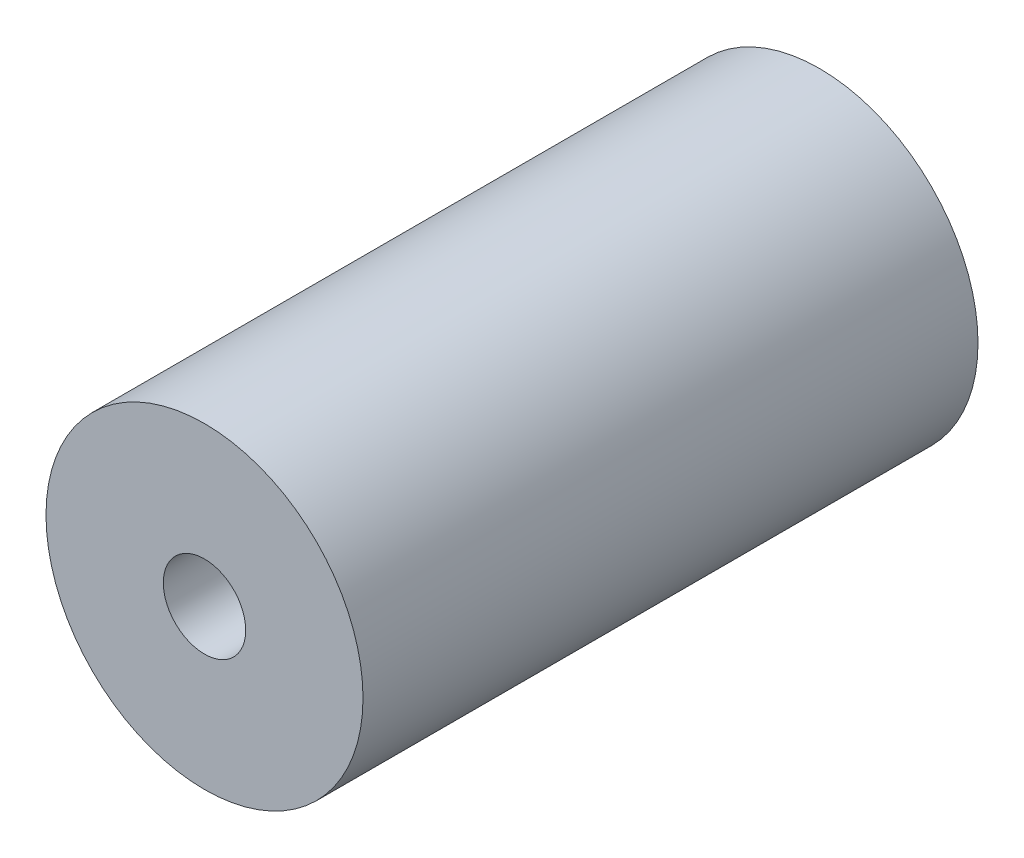
ISO-10303-21;
HEADER;
FILE_DESCRIPTION(('STEP AP214'),'2;1');
FILE_NAME('part.step','',(''),(''),'','','');
FILE_SCHEMA(('AUTOMOTIVE_DESIGN { 1 0 10303 214 1 1 1 1 }'));
ENDSEC;
DATA;
#1=APPLICATION_CONTEXT('core data for automotive mechanical design processes');
#2=APPLICATION_PROTOCOL_DEFINITION('international standard','automotive_design',2000,#1);
#3=PRODUCT_CONTEXT('',#1,'mechanical');
#4=PRODUCT('Part','Part','',(#3));
#5=PRODUCT_RELATED_PRODUCT_CATEGORY('part','',(#4));
#6=PRODUCT_DEFINITION_FORMATION('','',#4);
#7=PRODUCT_DEFINITION_CONTEXT('part definition',#1,'design');
#8=PRODUCT_DEFINITION('design','',#6,#7);
#9=PRODUCT_DEFINITION_SHAPE('','',#8);
#10=(LENGTH_UNIT() NAMED_UNIT(*) SI_UNIT(.MILLI.,.METRE.));
#11=(NAMED_UNIT(*) PLANE_ANGLE_UNIT() SI_UNIT($,.RADIAN.));
#12=(NAMED_UNIT(*) SI_UNIT($,.STERADIAN.) SOLID_ANGLE_UNIT());
#13=UNCERTAINTY_MEASURE_WITH_UNIT(LENGTH_MEASURE(1.E-05),#10,'distance_accuracy_value','');
#14=(GEOMETRIC_REPRESENTATION_CONTEXT(3) GLOBAL_UNCERTAINTY_ASSIGNED_CONTEXT((#13)) GLOBAL_UNIT_ASSIGNED_CONTEXT((#10,
#11,#12)) REPRESENTATION_CONTEXT('',''));
#15=CARTESIAN_POINT('',(0.,0.,0.));
#16=DIRECTION('',(0.,0.,1.));
#17=DIRECTION('',(1.,0.,0.));
#18=AXIS2_PLACEMENT_3D('',#15,#16,#17);
#19=CARTESIAN_POINT('',(0.,0.,19.4));
#20=DIRECTION('',(0.,0.,1.));
#21=DIRECTION('',(1.,0.,0.));
#22=AXIS2_PLACEMENT_3D('',#19,#20,#21);
#23=PLANE('',#22);
#24=CARTESIAN_POINT('',(0.,0.,19.4));
#25=DIRECTION('',(0.,0.,1.));
#26=DIRECTION('',(1.,0.,0.));
#27=AXIS2_PLACEMENT_3D('',#24,#25,#26);
#28=CIRCLE('',#27,5.);
#29=CARTESIAN_POINT('',(5.,0.,19.4));
#30=VERTEX_POINT('',#29);
#31=EDGE_CURVE('E10',#30,#30,#28,.T.);
#32=ORIENTED_EDGE('',*,*,#31,.T.);
#33=EDGE_LOOP('',(#32));
#34=FACE_BOUND('',#33,.T.);
#35=CARTESIAN_POINT('',(0.,0.,19.4));
#36=DIRECTION('',(0.,0.,1.));
#37=DIRECTION('',(1.,0.,0.));
#38=AXIS2_PLACEMENT_3D('',#35,#36,#37);
#39=CIRCLE('',#38,1.3);
#40=CARTESIAN_POINT('',(1.3,0.,19.4));
#41=VERTEX_POINT('',#40);
#42=EDGE_CURVE('E44',#41,#41,#39,.T.);
#43=ORIENTED_EDGE('',*,*,#42,.F.);
#44=EDGE_LOOP('',(#43));
#45=FACE_BOUND('',#44,.T.);
#46=ADVANCED_FACE('F33',(#34,#45),#23,.T.);
#47=CARTESIAN_POINT('',(0.,0.,0.));
#48=DIRECTION('',(0.,0.,1.));
#49=DIRECTION('',(1.,0.,0.));
#50=AXIS2_PLACEMENT_3D('',#47,#48,#49);
#51=PLANE('',#50);
#52=CARTESIAN_POINT('',(0.,0.,0.));
#53=DIRECTION('',(0.,0.,1.));
#54=DIRECTION('',(1.,0.,0.));
#55=AXIS2_PLACEMENT_3D('',#52,#53,#54);
#56=CIRCLE('',#55,5.);
#57=CARTESIAN_POINT('',(5.,0.,0.));
#58=VERTEX_POINT('',#57);
#59=EDGE_CURVE('E37',#58,#58,#56,.T.);
#60=ORIENTED_EDGE('',*,*,#59,.F.);
#61=EDGE_LOOP('',(#60));
#62=FACE_BOUND('',#61,.T.);
#63=CARTESIAN_POINT('',(0.,0.,0.));
#64=DIRECTION('',(0.,0.,1.));
#65=DIRECTION('',(1.,0.,0.));
#66=AXIS2_PLACEMENT_3D('',#63,#64,#65);
#67=CIRCLE('',#66,1.3);
#68=CARTESIAN_POINT('',(1.3,0.,0.));
#69=VERTEX_POINT('',#68);
#70=EDGE_CURVE('E46',#69,#69,#67,.T.);
#71=ORIENTED_EDGE('',*,*,#70,.T.);
#72=EDGE_LOOP('',(#71));
#73=FACE_BOUND('',#72,.T.);
#74=ADVANCED_FACE('F56',(#62,#73),#51,.F.);
#75=CARTESIAN_POINT('',(0.,0.,19.4));
#76=DIRECTION('',(0.,0.,-1.));
#77=DIRECTION('',(-1.,0.,0.));
#78=AXIS2_PLACEMENT_3D('',#75,#76,#77);
#79=CYLINDRICAL_SURFACE('',#78,5.);
#80=ORIENTED_EDGE('',*,*,#31,.F.);
#81=EDGE_LOOP('',(#80));
#82=FACE_BOUND('',#81,.T.);
#83=ORIENTED_EDGE('',*,*,#59,.T.);
#84=EDGE_LOOP('',(#83));
#85=FACE_BOUND('',#84,.T.);
#86=ADVANCED_FACE('F35',(#82,#85),#79,.T.);
#87=CARTESIAN_POINT('',(0.,0.,19.4));
#88=DIRECTION('',(0.,0.,-1.));
#89=DIRECTION('',(-1.,0.,0.));
#90=AXIS2_PLACEMENT_3D('',#87,#88,#89);
#91=CYLINDRICAL_SURFACE('',#90,1.3);
#92=ORIENTED_EDGE('',*,*,#42,.T.);
#93=EDGE_LOOP('',(#92));
#94=FACE_BOUND('',#93,.T.);
#95=ORIENTED_EDGE('',*,*,#70,.F.);
#96=EDGE_LOOP('',(#95));
#97=FACE_BOUND('',#96,.T.);
#98=ADVANCED_FACE('F52',(#94,#97),#91,.F.);
#99=CLOSED_SHELL('',(#46,#74,#86,#98));
#100=MANIFOLD_SOLID_BREP('B2',#99);
#101=ADVANCED_BREP_SHAPE_REPRESENTATION('',(#18,#100),#14);
#102=SHAPE_DEFINITION_REPRESENTATION(#9,#101);
ENDSEC;
END-ISO-10303-21;
